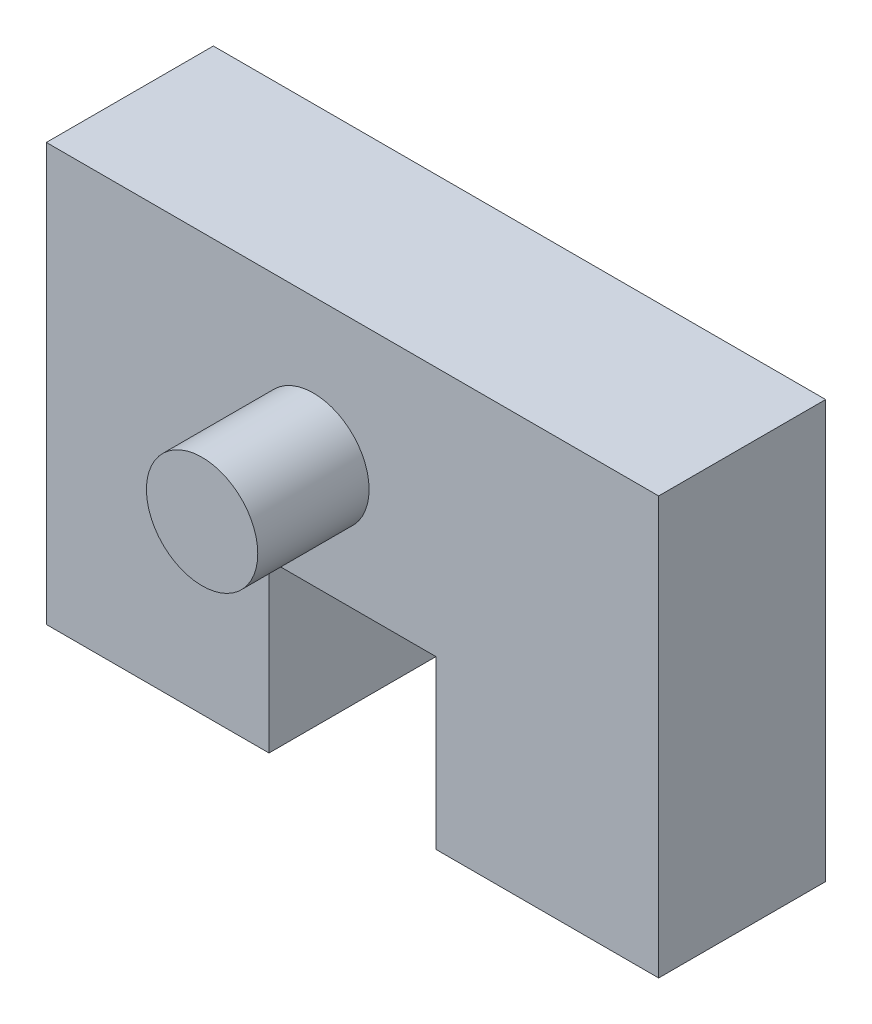
ISO-10303-21;
HEADER;
FILE_DESCRIPTION(('STEP AP214'),'2;1');
FILE_NAME('part.step','',(''),(''),'','','');
FILE_SCHEMA(('AUTOMOTIVE_DESIGN { 1 0 10303 214 1 1 1 1 }'));
ENDSEC;
DATA;
#1=APPLICATION_CONTEXT('core data for automotive mechanical design processes');
#2=APPLICATION_PROTOCOL_DEFINITION('international standard','automotive_design',2000,#1);
#3=PRODUCT_CONTEXT('',#1,'mechanical');
#4=PRODUCT('Part','Part','',(#3));
#5=PRODUCT_RELATED_PRODUCT_CATEGORY('part','',(#4));
#6=PRODUCT_DEFINITION_FORMATION('','',#4);
#7=PRODUCT_DEFINITION_CONTEXT('part definition',#1,'design');
#8=PRODUCT_DEFINITION('design','',#6,#7);
#9=PRODUCT_DEFINITION_SHAPE('','',#8);
#10=(LENGTH_UNIT() NAMED_UNIT(*) SI_UNIT(.MILLI.,.METRE.));
#11=(NAMED_UNIT(*) PLANE_ANGLE_UNIT() SI_UNIT($,.RADIAN.));
#12=(NAMED_UNIT(*) SI_UNIT($,.STERADIAN.) SOLID_ANGLE_UNIT());
#13=UNCERTAINTY_MEASURE_WITH_UNIT(LENGTH_MEASURE(1.E-05),#10,'distance_accuracy_value','');
#14=(GEOMETRIC_REPRESENTATION_CONTEXT(3) GLOBAL_UNCERTAINTY_ASSIGNED_CONTEXT((#13)) GLOBAL_UNIT_ASSIGNED_CONTEXT((#10,
#11,#12)) REPRESENTATION_CONTEXT('',''));
#15=CARTESIAN_POINT('',(0.,0.,0.));
#16=DIRECTION('',(0.,0.,1.));
#17=DIRECTION('',(1.,0.,0.));
#18=AXIS2_PLACEMENT_3D('',#15,#16,#17);
#19=CARTESIAN_POINT('',(0.,0.,6.));
#20=DIRECTION('',(0.,0.,1.));
#21=DIRECTION('',(1.,0.,0.));
#22=AXIS2_PLACEMENT_3D('',#19,#20,#21);
#23=PLANE('',#22);
#24=DIRECTION('',(-1.,0.,0.));
#25=VECTOR('',#24,1.);
#26=CARTESIAN_POINT('',(0.,6.,6.));
#27=LINE('',#26,#25);
#28=CARTESIAN_POINT('',(-8.,6.,6.));
#29=VERTEX_POINT('',#28);
#30=CARTESIAN_POINT('',(-14.,6.,6.));
#31=VERTEX_POINT('',#30);
#32=EDGE_CURVE('E148',#29,#31,#27,.T.);
#33=ORIENTED_EDGE('',*,*,#32,.F.);
#34=DIRECTION('',(0.,1.,0.));
#35=VECTOR('',#34,1.);
#36=CARTESIAN_POINT('',(-8.,0.,6.));
#37=LINE('',#36,#35);
#38=CARTESIAN_POINT('',(-8.,0.,6.));
#39=VERTEX_POINT('',#38);
#40=EDGE_CURVE('E181',#39,#29,#37,.T.);
#41=ORIENTED_EDGE('',*,*,#40,.F.);
#42=DIRECTION('',(-1.,0.,0.));
#43=VECTOR('',#42,1.);
#44=CARTESIAN_POINT('',(0.,0.,6.));
#45=LINE('',#44,#43);
#46=CARTESIAN_POINT('',(0.,0.,6.));
#47=VERTEX_POINT('',#46);
#48=EDGE_CURVE('E162',#47,#39,#45,.T.);
#49=ORIENTED_EDGE('',*,*,#48,.F.);
#50=DIRECTION('',(0.,1.,0.));
#51=VECTOR('',#50,1.);
#52=CARTESIAN_POINT('',(0.,0.,6.));
#53=LINE('',#52,#51);
#54=CARTESIAN_POINT('',(0.,15.,6.));
#55=VERTEX_POINT('',#54);
#56=EDGE_CURVE('E177',#47,#55,#53,.T.);
#57=ORIENTED_EDGE('',*,*,#56,.T.);
#58=DIRECTION('',(-1.,0.,0.));
#59=VECTOR('',#58,1.);
#60=CARTESIAN_POINT('',(0.,15.,6.));
#61=LINE('',#60,#59);
#62=CARTESIAN_POINT('',(-22.,15.,6.));
#63=VERTEX_POINT('',#62);
#64=EDGE_CURVE('E120',#55,#63,#61,.T.);
#65=ORIENTED_EDGE('',*,*,#64,.T.);
#66=DIRECTION('',(0.,1.,0.));
#67=VECTOR('',#66,1.);
#68=CARTESIAN_POINT('',(-22.,0.,6.));
#69=LINE('',#68,#67);
#70=CARTESIAN_POINT('',(-22.,0.,6.));
#71=VERTEX_POINT('',#70);
#72=EDGE_CURVE('E108',#71,#63,#69,.T.);
#73=ORIENTED_EDGE('',*,*,#72,.F.);
#74=DIRECTION('',(-1.,0.,0.));
#75=VECTOR('',#74,1.);
#76=CARTESIAN_POINT('',(0.,0.,6.));
#77=LINE('',#76,#75);
#78=CARTESIAN_POINT('',(-14.,0.,6.));
#79=VERTEX_POINT('',#78);
#80=EDGE_CURVE('E118',#79,#71,#77,.T.);
#81=ORIENTED_EDGE('',*,*,#80,.F.);
#82=DIRECTION('',(0.,1.,0.));
#83=VECTOR('',#82,1.);
#84=CARTESIAN_POINT('',(-14.,0.,6.));
#85=LINE('',#84,#83);
#86=EDGE_CURVE('E52',#79,#31,#85,.T.);
#87=ORIENTED_EDGE('',*,*,#86,.T.);
#88=EDGE_LOOP('',(#33,#41,#49,#57,#65,#73,#81,#87));
#89=FACE_BOUND('',#88,.T.);
#90=CARTESIAN_POINT('',(-12.4038416208929,10.,6.));
#91=DIRECTION('',(0.,0.,1.));
#92=DIRECTION('',(1.,0.,0.));
#93=AXIS2_PLACEMENT_3D('',#90,#91,#92);
#94=CIRCLE('',#93,1.99999999999971);
#95=CARTESIAN_POINT('',(-10.4038416208932,10.,6.));
#96=VERTEX_POINT('',#95);
#97=EDGE_CURVE('E184',#96,#96,#94,.T.);
#98=ORIENTED_EDGE('',*,*,#97,.F.);
#99=EDGE_LOOP('',(#98));
#100=FACE_BOUND('',#99,.T.);
#101=ADVANCED_FACE('F35',(#89,#100),#23,.T.);
#102=CARTESIAN_POINT('',(0.,6.,6.));
#103=DIRECTION('',(0.,-1.,0.));
#104=DIRECTION('',(1.,0.,0.));
#105=AXIS2_PLACEMENT_3D('',#102,#103,#104);
#106=PLANE('',#105);
#107=DIRECTION('',(-1.,0.,0.));
#108=VECTOR('',#107,1.);
#109=CARTESIAN_POINT('',(0.,6.,0.));
#110=LINE('',#109,#108);
#111=CARTESIAN_POINT('',(-8.,6.,0.));
#112=VERTEX_POINT('',#111);
#113=CARTESIAN_POINT('',(-14.,6.,0.));
#114=VERTEX_POINT('',#113);
#115=EDGE_CURVE('E128',#112,#114,#110,.T.);
#116=ORIENTED_EDGE('',*,*,#115,.F.);
#117=DIRECTION('',(0.,0.,-1.));
#118=VECTOR('',#117,1.);
#119=CARTESIAN_POINT('',(-8.,6.,6.));
#120=LINE('',#119,#118);
#121=EDGE_CURVE('E11',#29,#112,#120,.T.);
#122=ORIENTED_EDGE('',*,*,#121,.F.);
#123=ORIENTED_EDGE('',*,*,#32,.T.);
#124=DIRECTION('',(0.,0.,-1.));
#125=VECTOR('',#124,1.);
#126=CARTESIAN_POINT('',(-14.,6.,6.));
#127=LINE('',#126,#125);
#128=EDGE_CURVE('E86',#31,#114,#127,.T.);
#129=ORIENTED_EDGE('',*,*,#128,.T.);
#130=EDGE_LOOP('',(#116,#122,#123,#129));
#131=FACE_BOUND('',#130,.T.);
#132=ADVANCED_FACE('F37',(#131),#106,.T.);
#133=CARTESIAN_POINT('',(-8.,0.,6.));
#134=DIRECTION('',(-1.,0.,0.));
#135=DIRECTION('',(0.,0.,1.));
#136=AXIS2_PLACEMENT_3D('',#133,#134,#135);
#137=PLANE('',#136);
#138=DIRECTION('',(0.,1.,0.));
#139=VECTOR('',#138,1.);
#140=CARTESIAN_POINT('',(-8.,0.,0.));
#141=LINE('',#140,#139);
#142=CARTESIAN_POINT('',(-8.,0.,0.));
#143=VERTEX_POINT('',#142);
#144=EDGE_CURVE('E131',#143,#112,#141,.T.);
#145=ORIENTED_EDGE('',*,*,#144,.F.);
#146=DIRECTION('',(0.,0.,-1.));
#147=VECTOR('',#146,1.);
#148=CARTESIAN_POINT('',(-8.,0.,6.));
#149=LINE('',#148,#147);
#150=EDGE_CURVE('E44',#39,#143,#149,.T.);
#151=ORIENTED_EDGE('',*,*,#150,.F.);
#152=ORIENTED_EDGE('',*,*,#40,.T.);
#153=ORIENTED_EDGE('',*,*,#121,.T.);
#154=EDGE_LOOP('',(#145,#151,#152,#153));
#155=FACE_BOUND('',#154,.T.);
#156=ADVANCED_FACE('F166',(#155),#137,.T.);
#157=CARTESIAN_POINT('',(0.,0.,6.));
#158=DIRECTION('',(0.,-1.,0.));
#159=DIRECTION('',(1.,0.,0.));
#160=AXIS2_PLACEMENT_3D('',#157,#158,#159);
#161=PLANE('',#160);
#162=DIRECTION('',(-1.,0.,0.));
#163=VECTOR('',#162,1.);
#164=CARTESIAN_POINT('',(0.,0.,0.));
#165=LINE('',#164,#163);
#166=CARTESIAN_POINT('',(0.,0.,0.));
#167=VERTEX_POINT('',#166);
#168=EDGE_CURVE('E135',#167,#143,#165,.T.);
#169=ORIENTED_EDGE('',*,*,#168,.F.);
#170=DIRECTION('',(0.,0.,-1.));
#171=VECTOR('',#170,1.);
#172=CARTESIAN_POINT('',(0.,0.,6.));
#173=LINE('',#172,#171);
#174=EDGE_CURVE('E155',#47,#167,#173,.T.);
#175=ORIENTED_EDGE('',*,*,#174,.F.);
#176=ORIENTED_EDGE('',*,*,#48,.T.);
#177=ORIENTED_EDGE('',*,*,#150,.T.);
#178=EDGE_LOOP('',(#169,#175,#176,#177));
#179=FACE_BOUND('',#178,.T.);
#180=ADVANCED_FACE('F160',(#179),#161,.T.);
#181=CARTESIAN_POINT('',(0.,0.,6.));
#182=DIRECTION('',(-1.,0.,0.));
#183=DIRECTION('',(0.,0.,1.));
#184=AXIS2_PLACEMENT_3D('',#181,#182,#183);
#185=PLANE('',#184);
#186=DIRECTION('',(0.,1.,0.));
#187=VECTOR('',#186,1.);
#188=CARTESIAN_POINT('',(0.,0.,0.));
#189=LINE('',#188,#187);
#190=CARTESIAN_POINT('',(0.,15.,0.));
#191=VERTEX_POINT('',#190);
#192=EDGE_CURVE('E138',#167,#191,#189,.T.);
#193=ORIENTED_EDGE('',*,*,#192,.T.);
#194=DIRECTION('',(0.,0.,-1.));
#195=VECTOR('',#194,1.);
#196=CARTESIAN_POINT('',(0.,15.,6.));
#197=LINE('',#196,#195);
#198=EDGE_CURVE('E152',#55,#191,#197,.T.);
#199=ORIENTED_EDGE('',*,*,#198,.F.);
#200=ORIENTED_EDGE('',*,*,#56,.F.);
#201=ORIENTED_EDGE('',*,*,#174,.T.);
#202=EDGE_LOOP('',(#193,#199,#200,#201));
#203=FACE_BOUND('',#202,.T.);
#204=ADVANCED_FACE('F173',(#203),#185,.F.);
#205=CARTESIAN_POINT('',(0.,15.,6.));
#206=DIRECTION('',(0.,-1.,0.));
#207=DIRECTION('',(1.,0.,0.));
#208=AXIS2_PLACEMENT_3D('',#205,#206,#207);
#209=PLANE('',#208);
#210=DIRECTION('',(-1.,0.,0.));
#211=VECTOR('',#210,1.);
#212=CARTESIAN_POINT('',(0.,15.,0.));
#213=LINE('',#212,#211);
#214=CARTESIAN_POINT('',(-22.,15.,0.));
#215=VERTEX_POINT('',#214);
#216=EDGE_CURVE('E140',#191,#215,#213,.T.);
#217=ORIENTED_EDGE('',*,*,#216,.T.);
#218=DIRECTION('',(0.,0.,-1.));
#219=VECTOR('',#218,1.);
#220=CARTESIAN_POINT('',(-22.,15.,6.));
#221=LINE('',#220,#219);
#222=EDGE_CURVE('E115',#63,#215,#221,.T.);
#223=ORIENTED_EDGE('',*,*,#222,.F.);
#224=ORIENTED_EDGE('',*,*,#64,.F.);
#225=ORIENTED_EDGE('',*,*,#198,.T.);
#226=EDGE_LOOP('',(#217,#223,#224,#225));
#227=FACE_BOUND('',#226,.T.);
#228=ADVANCED_FACE('F176',(#227),#209,.F.);
#229=CARTESIAN_POINT('',(-22.,0.,6.));
#230=DIRECTION('',(-1.,0.,0.));
#231=DIRECTION('',(0.,0.,1.));
#232=AXIS2_PLACEMENT_3D('',#229,#230,#231);
#233=PLANE('',#232);
#234=DIRECTION('',(0.,1.,0.));
#235=VECTOR('',#234,1.);
#236=CARTESIAN_POINT('',(-22.,0.,0.));
#237=LINE('',#236,#235);
#238=CARTESIAN_POINT('',(-22.,0.,0.));
#239=VERTEX_POINT('',#238);
#240=EDGE_CURVE('E110',#239,#215,#237,.T.);
#241=ORIENTED_EDGE('',*,*,#240,.F.);
#242=DIRECTION('',(0.,0.,-1.));
#243=VECTOR('',#242,1.);
#244=CARTESIAN_POINT('',(-22.,0.,6.));
#245=LINE('',#244,#243);
#246=EDGE_CURVE('E105',#71,#239,#245,.T.);
#247=ORIENTED_EDGE('',*,*,#246,.F.);
#248=ORIENTED_EDGE('',*,*,#72,.T.);
#249=ORIENTED_EDGE('',*,*,#222,.T.);
#250=EDGE_LOOP('',(#241,#247,#248,#249));
#251=FACE_BOUND('',#250,.T.);
#252=ADVANCED_FACE('F107',(#251),#233,.T.);
#253=CARTESIAN_POINT('',(0.,0.,6.));
#254=DIRECTION('',(0.,-1.,0.));
#255=DIRECTION('',(1.,0.,0.));
#256=AXIS2_PLACEMENT_3D('',#253,#254,#255);
#257=PLANE('',#256);
#258=DIRECTION('',(-1.,0.,0.));
#259=VECTOR('',#258,1.);
#260=CARTESIAN_POINT('',(0.,0.,0.));
#261=LINE('',#260,#259);
#262=CARTESIAN_POINT('',(-14.,0.,0.));
#263=VERTEX_POINT('',#262);
#264=EDGE_CURVE('E144',#263,#239,#261,.T.);
#265=ORIENTED_EDGE('',*,*,#264,.F.);
#266=DIRECTION('',(0.,0.,-1.));
#267=VECTOR('',#266,1.);
#268=CARTESIAN_POINT('',(-14.,0.,6.));
#269=LINE('',#268,#267);
#270=EDGE_CURVE('E79',#79,#263,#269,.T.);
#271=ORIENTED_EDGE('',*,*,#270,.F.);
#272=ORIENTED_EDGE('',*,*,#80,.T.);
#273=ORIENTED_EDGE('',*,*,#246,.T.);
#274=EDGE_LOOP('',(#265,#271,#272,#273));
#275=FACE_BOUND('',#274,.T.);
#276=ADVANCED_FACE('F123',(#275),#257,.T.);
#277=CARTESIAN_POINT('',(-14.,0.,6.));
#278=DIRECTION('',(-1.,0.,0.));
#279=DIRECTION('',(0.,0.,1.));
#280=AXIS2_PLACEMENT_3D('',#277,#278,#279);
#281=PLANE('',#280);
#282=DIRECTION('',(0.,1.,0.));
#283=VECTOR('',#282,1.);
#284=CARTESIAN_POINT('',(-14.,0.,0.));
#285=LINE('',#284,#283);
#286=EDGE_CURVE('E146',#263,#114,#285,.T.);
#287=ORIENTED_EDGE('',*,*,#286,.T.);
#288=ORIENTED_EDGE('',*,*,#128,.F.);
#289=ORIENTED_EDGE('',*,*,#86,.F.);
#290=ORIENTED_EDGE('',*,*,#270,.T.);
#291=EDGE_LOOP('',(#287,#288,#289,#290));
#292=FACE_BOUND('',#291,.T.);
#293=ADVANCED_FACE('F208',(#292),#281,.F.);
#294=CARTESIAN_POINT('',(0.,0.,0.));
#295=DIRECTION('',(0.,0.,1.));
#296=DIRECTION('',(1.,0.,0.));
#297=AXIS2_PLACEMENT_3D('',#294,#295,#296);
#298=PLANE('',#297);
#299=ORIENTED_EDGE('',*,*,#115,.T.);
#300=ORIENTED_EDGE('',*,*,#286,.F.);
#301=ORIENTED_EDGE('',*,*,#264,.T.);
#302=ORIENTED_EDGE('',*,*,#240,.T.);
#303=ORIENTED_EDGE('',*,*,#216,.F.);
#304=ORIENTED_EDGE('',*,*,#192,.F.);
#305=ORIENTED_EDGE('',*,*,#168,.T.);
#306=ORIENTED_EDGE('',*,*,#144,.T.);
#307=EDGE_LOOP('',(#299,#300,#301,#302,#303,#304,#305,#306));
#308=FACE_BOUND('',#307,.T.);
#309=ADVANCED_FACE('F169',(#308),#298,.F.);
#310=CARTESIAN_POINT('',(-12.4038416208929,10.,10.));
#311=DIRECTION('',(0.,0.,-1.));
#312=DIRECTION('',(-1.,0.,0.));
#313=AXIS2_PLACEMENT_3D('',#310,#311,#312);
#314=CYLINDRICAL_SURFACE('',#313,1.99999999999971);
#315=CARTESIAN_POINT('',(-12.4038416208929,10.,10.));
#316=DIRECTION('',(0.,0.,1.));
#317=DIRECTION('',(1.,0.,0.));
#318=AXIS2_PLACEMENT_3D('',#315,#316,#317);
#319=CIRCLE('',#318,1.99999999999971);
#320=CARTESIAN_POINT('',(-10.4038416208932,10.,10.));
#321=VERTEX_POINT('',#320);
#322=EDGE_CURVE('E132',#321,#321,#319,.T.);
#323=ORIENTED_EDGE('',*,*,#322,.F.);
#324=EDGE_LOOP('',(#323));
#325=FACE_BOUND('',#324,.T.);
#326=ORIENTED_EDGE('',*,*,#97,.T.);
#327=EDGE_LOOP('',(#326));
#328=FACE_BOUND('',#327,.T.);
#329=ADVANCED_FACE('F192',(#325,#328),#314,.T.);
#330=CARTESIAN_POINT('',(-12.4038416208929,10.,10.));
#331=DIRECTION('',(0.,0.,1.));
#332=DIRECTION('',(1.,0.,0.));
#333=AXIS2_PLACEMENT_3D('',#330,#331,#332);
#334=PLANE('',#333);
#335=ORIENTED_EDGE('',*,*,#322,.T.);
#336=EDGE_LOOP('',(#335));
#337=FACE_BOUND('',#336,.T.);
#338=ADVANCED_FACE('F190',(#337),#334,.T.);
#339=CLOSED_SHELL('',(#101,#132,#156,#180,#204,#228,#252,#276,#293,#309,#329,#338));
#340=MANIFOLD_SOLID_BREP('B2',#339);
#341=ADVANCED_BREP_SHAPE_REPRESENTATION('',(#18,#340),#14);
#342=SHAPE_DEFINITION_REPRESENTATION(#9,#341);
ENDSEC;
END-ISO-10303-21;
